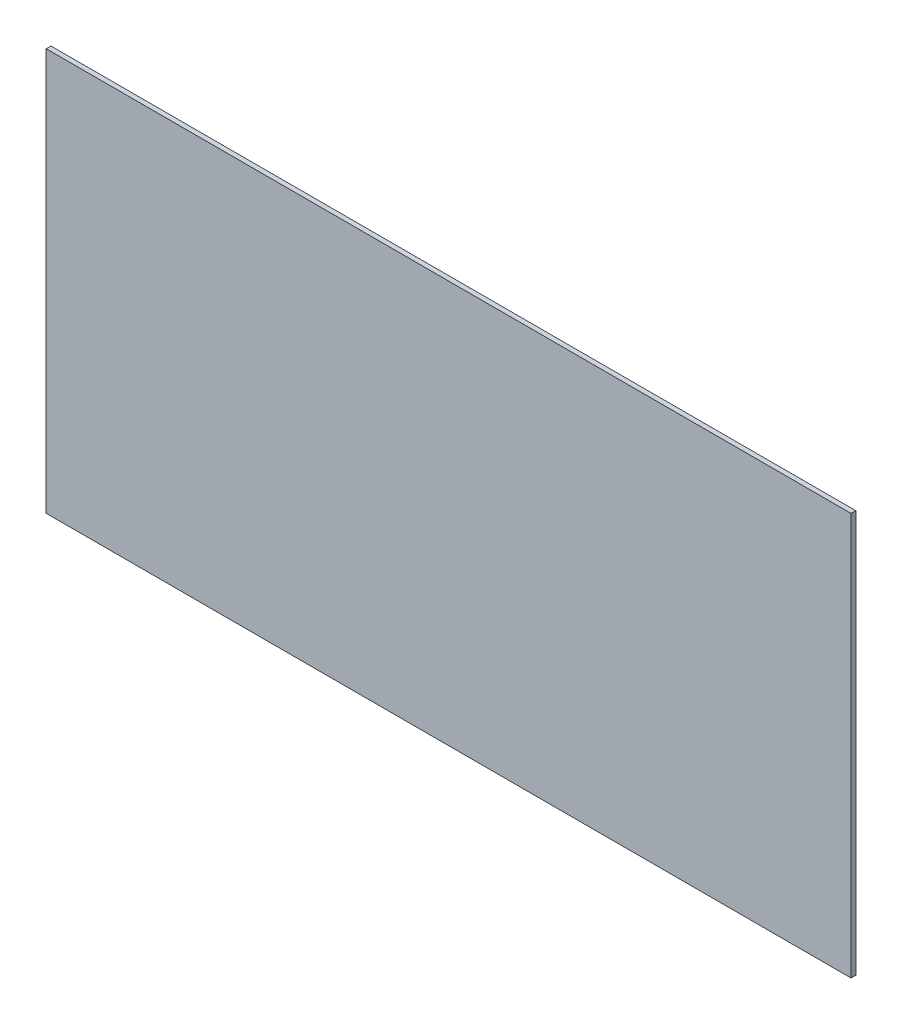
ISO-10303-21;
HEADER;
FILE_DESCRIPTION(('STEP AP214'),'2;1');
FILE_NAME('part.step','',(''),(''),'','','');
FILE_SCHEMA(('AUTOMOTIVE_DESIGN { 1 0 10303 214 1 1 1 1 }'));
ENDSEC;
DATA;
#1=APPLICATION_CONTEXT('core data for automotive mechanical design processes');
#2=APPLICATION_PROTOCOL_DEFINITION('international standard','automotive_design',2000,#1);
#3=PRODUCT_CONTEXT('',#1,'mechanical');
#4=PRODUCT('Part','Part','',(#3));
#5=PRODUCT_RELATED_PRODUCT_CATEGORY('part','',(#4));
#6=PRODUCT_DEFINITION_FORMATION('','',#4);
#7=PRODUCT_DEFINITION_CONTEXT('part definition',#1,'design');
#8=PRODUCT_DEFINITION('design','',#6,#7);
#9=PRODUCT_DEFINITION_SHAPE('','',#8);
#10=(LENGTH_UNIT() NAMED_UNIT(*) SI_UNIT(.MILLI.,.METRE.));
#11=(NAMED_UNIT(*) PLANE_ANGLE_UNIT() SI_UNIT($,.RADIAN.));
#12=(NAMED_UNIT(*) SI_UNIT($,.STERADIAN.) SOLID_ANGLE_UNIT());
#13=UNCERTAINTY_MEASURE_WITH_UNIT(LENGTH_MEASURE(1.E-05),#10,'distance_accuracy_value','');
#14=(GEOMETRIC_REPRESENTATION_CONTEXT(3) GLOBAL_UNCERTAINTY_ASSIGNED_CONTEXT((#13)) GLOBAL_UNIT_ASSIGNED_CONTEXT((#10,
#11,#12)) REPRESENTATION_CONTEXT('',''));
#15=CARTESIAN_POINT('',(0.,0.,0.));
#16=DIRECTION('',(0.,0.,1.));
#17=DIRECTION('',(1.,0.,0.));
#18=AXIS2_PLACEMENT_3D('',#15,#16,#17);
#19=CARTESIAN_POINT('',(170.,-85.,2.));
#20=DIRECTION('',(-1.,0.,0.));
#21=DIRECTION('',(0.,0.,1.));
#22=AXIS2_PLACEMENT_3D('',#19,#20,#21);
#23=PLANE('',#22);
#24=DIRECTION('',(0.,1.,0.));
#25=VECTOR('',#24,1.);
#26=CARTESIAN_POINT('',(170.,-85.,0.));
#27=LINE('',#26,#25);
#28=CARTESIAN_POINT('',(170.,-85.,0.));
#29=VERTEX_POINT('',#28);
#30=CARTESIAN_POINT('',(170.,85.,0.));
#31=VERTEX_POINT('',#30);
#32=EDGE_CURVE('E96',#29,#31,#27,.T.);
#33=ORIENTED_EDGE('',*,*,#32,.T.);
#34=DIRECTION('',(0.,0.,-1.));
#35=VECTOR('',#34,1.);
#36=CARTESIAN_POINT('',(170.,85.,2.));
#37=LINE('',#36,#35);
#38=CARTESIAN_POINT('',(170.,85.,2.));
#39=VERTEX_POINT('',#38);
#40=EDGE_CURVE('E11',#39,#31,#37,.T.);
#41=ORIENTED_EDGE('',*,*,#40,.F.);
#42=DIRECTION('',(0.,1.,0.));
#43=VECTOR('',#42,1.);
#44=CARTESIAN_POINT('',(170.,-85.,2.));
#45=LINE('',#44,#43);
#46=CARTESIAN_POINT('',(170.,-85.,2.));
#47=VERTEX_POINT('',#46);
#48=EDGE_CURVE('E84',#47,#39,#45,.T.);
#49=ORIENTED_EDGE('',*,*,#48,.F.);
#50=DIRECTION('',(0.,0.,-1.));
#51=VECTOR('',#50,1.);
#52=CARTESIAN_POINT('',(170.,-85.,2.));
#53=LINE('',#52,#51);
#54=EDGE_CURVE('E92',#47,#29,#53,.T.);
#55=ORIENTED_EDGE('',*,*,#54,.T.);
#56=EDGE_LOOP('',(#33,#41,#49,#55));
#57=FACE_BOUND('',#56,.T.);
#58=ADVANCED_FACE('F33',(#57),#23,.F.);
#59=CARTESIAN_POINT('',(-170.,85.,2.));
#60=DIRECTION('',(0.,-1.,0.));
#61=DIRECTION('',(0.,0.,-1.));
#62=AXIS2_PLACEMENT_3D('',#59,#60,#61);
#63=PLANE('',#62);
#64=DIRECTION('',(-1.,0.,0.));
#65=VECTOR('',#64,1.);
#66=CARTESIAN_POINT('',(-170.,85.,0.));
#67=LINE('',#66,#65);
#68=CARTESIAN_POINT('',(-170.,85.,0.));
#69=VERTEX_POINT('',#68);
#70=EDGE_CURVE('E88',#31,#69,#67,.T.);
#71=ORIENTED_EDGE('',*,*,#70,.T.);
#72=DIRECTION('',(0.,0.,-1.));
#73=VECTOR('',#72,1.);
#74=CARTESIAN_POINT('',(-170.,85.,2.));
#75=LINE('',#74,#73);
#76=CARTESIAN_POINT('',(-170.,85.,2.));
#77=VERTEX_POINT('',#76);
#78=EDGE_CURVE('E41',#77,#69,#75,.T.);
#79=ORIENTED_EDGE('',*,*,#78,.F.);
#80=DIRECTION('',(-1.,0.,0.));
#81=VECTOR('',#80,1.);
#82=CARTESIAN_POINT('',(-170.,85.,2.));
#83=LINE('',#82,#81);
#84=EDGE_CURVE('E79',#39,#77,#83,.T.);
#85=ORIENTED_EDGE('',*,*,#84,.F.);
#86=ORIENTED_EDGE('',*,*,#40,.T.);
#87=EDGE_LOOP('',(#71,#79,#85,#86));
#88=FACE_BOUND('',#87,.T.);
#89=ADVANCED_FACE('F87',(#88),#63,.F.);
#90=CARTESIAN_POINT('',(-170.,-85.,2.));
#91=DIRECTION('',(1.,0.,0.));
#92=DIRECTION('',(0.,0.,-1.));
#93=AXIS2_PLACEMENT_3D('',#90,#91,#92);
#94=PLANE('',#93);
#95=DIRECTION('',(0.,-1.,0.));
#96=VECTOR('',#95,1.);
#97=CARTESIAN_POINT('',(-170.,-85.,0.));
#98=LINE('',#97,#96);
#99=CARTESIAN_POINT('',(-170.,-85.,0.));
#100=VERTEX_POINT('',#99);
#101=EDGE_CURVE('E66',#69,#100,#98,.T.);
#102=ORIENTED_EDGE('',*,*,#101,.T.);
#103=DIRECTION('',(0.,0.,-1.));
#104=VECTOR('',#103,1.);
#105=CARTESIAN_POINT('',(-170.,-85.,2.));
#106=LINE('',#105,#104);
#107=CARTESIAN_POINT('',(-170.,-85.,2.));
#108=VERTEX_POINT('',#107);
#109=EDGE_CURVE('E89',#108,#100,#106,.T.);
#110=ORIENTED_EDGE('',*,*,#109,.F.);
#111=DIRECTION('',(0.,-1.,0.));
#112=VECTOR('',#111,1.);
#113=CARTESIAN_POINT('',(-170.,-85.,2.));
#114=LINE('',#113,#112);
#115=EDGE_CURVE('E82',#77,#108,#114,.T.);
#116=ORIENTED_EDGE('',*,*,#115,.F.);
#117=ORIENTED_EDGE('',*,*,#78,.T.);
#118=EDGE_LOOP('',(#102,#110,#116,#117));
#119=FACE_BOUND('',#118,.T.);
#120=ADVANCED_FACE('F90',(#119),#94,.F.);
#121=CARTESIAN_POINT('',(-170.,-85.,2.));
#122=DIRECTION('',(0.,1.,0.));
#123=DIRECTION('',(0.,0.,1.));
#124=AXIS2_PLACEMENT_3D('',#121,#122,#123);
#125=PLANE('',#124);
#126=DIRECTION('',(1.,0.,0.));
#127=VECTOR('',#126,1.);
#128=CARTESIAN_POINT('',(-170.,-85.,0.));
#129=LINE('',#128,#127);
#130=EDGE_CURVE('E72',#100,#29,#129,.T.);
#131=ORIENTED_EDGE('',*,*,#130,.T.);
#132=ORIENTED_EDGE('',*,*,#54,.F.);
#133=DIRECTION('',(1.,0.,0.));
#134=VECTOR('',#133,1.);
#135=CARTESIAN_POINT('',(-170.,-85.,2.));
#136=LINE('',#135,#134);
#137=EDGE_CURVE('E49',#108,#47,#136,.T.);
#138=ORIENTED_EDGE('',*,*,#137,.F.);
#139=ORIENTED_EDGE('',*,*,#109,.T.);
#140=EDGE_LOOP('',(#131,#132,#138,#139));
#141=FACE_BOUND('',#140,.T.);
#142=ADVANCED_FACE('F103',(#141),#125,.F.);
#143=CARTESIAN_POINT('',(0.,0.,2.));
#144=DIRECTION('',(0.,0.,-1.));
#145=DIRECTION('',(-1.,0.,0.));
#146=AXIS2_PLACEMENT_3D('',#143,#144,#145);
#147=PLANE('',#146);
#148=ORIENTED_EDGE('',*,*,#48,.T.);
#149=ORIENTED_EDGE('',*,*,#84,.T.);
#150=ORIENTED_EDGE('',*,*,#115,.T.);
#151=ORIENTED_EDGE('',*,*,#137,.T.);
#152=EDGE_LOOP('',(#148,#149,#150,#151));
#153=FACE_BOUND('',#152,.T.);
#154=ADVANCED_FACE('F80',(#153),#147,.F.);
#155=CARTESIAN_POINT('',(0.,0.,0.));
#156=DIRECTION('',(0.,0.,-1.));
#157=DIRECTION('',(-1.,0.,0.));
#158=AXIS2_PLACEMENT_3D('',#155,#156,#157);
#159=PLANE('',#158);
#160=ORIENTED_EDGE('',*,*,#32,.F.);
#161=ORIENTED_EDGE('',*,*,#130,.F.);
#162=ORIENTED_EDGE('',*,*,#101,.F.);
#163=ORIENTED_EDGE('',*,*,#70,.F.);
#164=EDGE_LOOP('',(#160,#161,#162,#163));
#165=FACE_BOUND('',#164,.T.);
#166=ADVANCED_FACE('F106',(#165),#159,.T.);
#167=CLOSED_SHELL('',(#58,#89,#120,#142,#154,#166));
#168=MANIFOLD_SOLID_BREP('B2',#167);
#169=ADVANCED_BREP_SHAPE_REPRESENTATION('',(#18,#168),#14);
#170=SHAPE_DEFINITION_REPRESENTATION(#9,#169);
ENDSEC;
END-ISO-10303-21;
